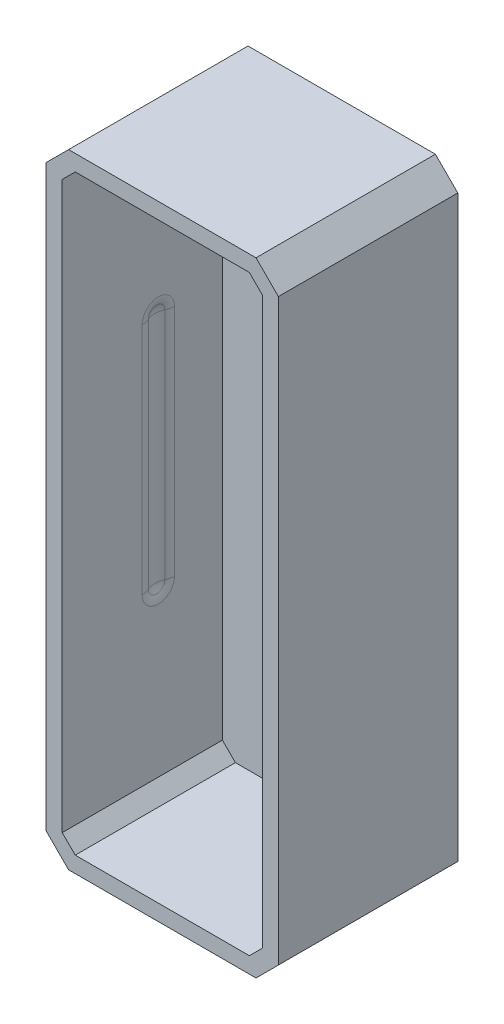
ISO-10303-21;
HEADER;
FILE_DESCRIPTION(('STEP AP214'),'2;1');
FILE_NAME('part.step','',(''),(''),'','','');
FILE_SCHEMA(('AUTOMOTIVE_DESIGN { 1 0 10303 214 1 1 1 1 }'));
ENDSEC;
DATA;
#1=APPLICATION_CONTEXT('core data for automotive mechanical design processes');
#2=APPLICATION_PROTOCOL_DEFINITION('international standard','automotive_design',2000,#1);
#3=PRODUCT_CONTEXT('',#1,'mechanical');
#4=PRODUCT('Part','Part','',(#3));
#5=PRODUCT_RELATED_PRODUCT_CATEGORY('part','',(#4));
#6=PRODUCT_DEFINITION_FORMATION('','',#4);
#7=PRODUCT_DEFINITION_CONTEXT('part definition',#1,'design');
#8=PRODUCT_DEFINITION('design','',#6,#7);
#9=PRODUCT_DEFINITION_SHAPE('','',#8);
#10=(LENGTH_UNIT() NAMED_UNIT(*) SI_UNIT(.MILLI.,.METRE.));
#11=(NAMED_UNIT(*) PLANE_ANGLE_UNIT() SI_UNIT($,.RADIAN.));
#12=(NAMED_UNIT(*) SI_UNIT($,.STERADIAN.) SOLID_ANGLE_UNIT());
#13=UNCERTAINTY_MEASURE_WITH_UNIT(LENGTH_MEASURE(1.E-05),#10,'distance_accuracy_value','');
#14=(GEOMETRIC_REPRESENTATION_CONTEXT(3) GLOBAL_UNCERTAINTY_ASSIGNED_CONTEXT((#13)) GLOBAL_UNIT_ASSIGNED_CONTEXT((#10,
#11,#12)) REPRESENTATION_CONTEXT('',''));
#15=CARTESIAN_POINT('',(0.,0.,0.));
#16=DIRECTION('',(0.,0.,1.));
#17=DIRECTION('',(1.,0.,0.));
#18=AXIS2_PLACEMENT_3D('',#15,#16,#17);
#19=CARTESIAN_POINT('',(15.6182481042385,-44.1430822833915,25.));
#20=DIRECTION('',(-1.,0.,0.));
#21=DIRECTION('',(0.,0.,1.));
#22=AXIS2_PLACEMENT_3D('',#19,#20,#21);
#23=PLANE('',#22);
#24=CARTESIAN_POINT('',(15.6182481042385,-18.2371897436196,9.99999999999999));
#25=DIRECTION('',(-1.,0.,0.));
#26=DIRECTION('',(0.,0.,1.));
#27=AXIS2_PLACEMENT_3D('',#24,#25,#26);
#28=CIRCLE('',#27,2.53130401176941);
#29=CARTESIAN_POINT('',(15.6182481042385,-18.2371897436196,12.5313040117694));
#30=VERTEX_POINT('',#29);
#31=CARTESIAN_POINT('',(15.6182481042385,-18.2371897436196,7.46869598823058));
#32=VERTEX_POINT('',#31);
#33=EDGE_CURVE('E376',#30,#32,#28,.F.);
#34=ORIENTED_EDGE('',*,*,#33,.T.);
#35=DIRECTION('',(0.,1.,0.));
#36=VECTOR('',#35,1.);
#37=CARTESIAN_POINT('',(15.6182481042385,-44.1430822833915,7.46869598823058));
#38=LINE('',#37,#36);
#39=CARTESIAN_POINT('',(15.6182481042385,18.2371897436196,7.46869598823058));
#40=VERTEX_POINT('',#39);
#41=EDGE_CURVE('E381',#32,#40,#38,.T.);
#42=ORIENTED_EDGE('',*,*,#41,.T.);
#43=CARTESIAN_POINT('',(15.6182481042385,18.2371897436196,9.99999999999999));
#44=DIRECTION('',(-1.,0.,0.));
#45=DIRECTION('',(0.,0.,1.));
#46=AXIS2_PLACEMENT_3D('',#43,#44,#45);
#47=CIRCLE('',#46,2.53130401176941);
#48=CARTESIAN_POINT('',(15.6182481042385,18.2371897436196,12.5313040117694));
#49=VERTEX_POINT('',#48);
#50=EDGE_CURVE('E378',#40,#49,#47,.F.);
#51=ORIENTED_EDGE('',*,*,#50,.T.);
#52=DIRECTION('',(0.,1.,0.));
#53=VECTOR('',#52,1.);
#54=CARTESIAN_POINT('',(15.6182481042385,-44.1430822833915,12.5313040117694));
#55=LINE('',#54,#53);
#56=EDGE_CURVE('E374',#49,#30,#55,.F.);
#57=ORIENTED_EDGE('',*,*,#56,.T.);
#58=EDGE_LOOP('',(#34,#42,#51,#57));
#59=FACE_BOUND('',#58,.T.);
#60=DIRECTION('',(0.,1.,0.));
#61=VECTOR('',#60,1.);
#62=CARTESIAN_POINT('',(15.6182481042385,-44.1430822833915,0.));
#63=LINE('',#62,#61);
#64=CARTESIAN_POINT('',(15.6182481042385,-44.1430822833915,0.));
#65=VERTEX_POINT('',#64);
#66=CARTESIAN_POINT('',(15.6182481042385,44.1430822833914,0.));
#67=VERTEX_POINT('',#66);
#68=EDGE_CURVE('E213',#65,#67,#63,.T.);
#69=ORIENTED_EDGE('',*,*,#68,.F.);
#70=DIRECTION('',(0.,0.,-1.));
#71=VECTOR('',#70,1.);
#72=CARTESIAN_POINT('',(15.6182481042385,-44.1430822833915,25.));
#73=LINE('',#72,#71);
#74=CARTESIAN_POINT('',(15.6182481042385,-44.1430822833915,25.));
#75=VERTEX_POINT('',#74);
#76=EDGE_CURVE('E258',#75,#65,#73,.T.);
#77=ORIENTED_EDGE('',*,*,#76,.F.);
#78=DIRECTION('',(0.,1.,0.));
#79=VECTOR('',#78,1.);
#80=CARTESIAN_POINT('',(15.6182481042385,-44.1430822833915,25.));
#81=LINE('',#80,#79);
#82=CARTESIAN_POINT('',(15.6182481042385,44.1430822833914,25.));
#83=VERTEX_POINT('',#82);
#84=EDGE_CURVE('E240',#75,#83,#81,.T.);
#85=ORIENTED_EDGE('',*,*,#84,.T.);
#86=DIRECTION('',(0.,0.,-1.));
#87=VECTOR('',#86,1.);
#88=CARTESIAN_POINT('',(15.6182481042385,44.1430822833914,25.));
#89=LINE('',#88,#87);
#90=EDGE_CURVE('E208',#83,#67,#89,.T.);
#91=ORIENTED_EDGE('',*,*,#90,.T.);
#92=EDGE_LOOP('',(#69,#77,#85,#91));
#93=FACE_BOUND('',#92,.T.);
#94=ADVANCED_FACE('F39',(#59,#93),#23,.T.);
#95=CARTESIAN_POINT('',(-15.6182481042385,44.1430822833914,25.));
#96=DIRECTION('',(1.,0.,0.));
#97=DIRECTION('',(0.,0.,-1.));
#98=AXIS2_PLACEMENT_3D('',#95,#96,#97);
#99=PLANE('',#98);
#100=CARTESIAN_POINT('',(-15.6182481042385,-18.2371897436196,9.99999999999999));
#101=DIRECTION('',(1.,0.,0.));
#102=DIRECTION('',(0.,0.,-1.));
#103=AXIS2_PLACEMENT_3D('',#100,#101,#102);
#104=CIRCLE('',#103,2.53130401176944);
#105=CARTESIAN_POINT('',(-15.6182481042385,-18.2371897436196,7.46869598823055));
#106=VERTEX_POINT('',#105);
#107=CARTESIAN_POINT('',(-15.6182481042385,-18.2371897436196,12.5313040117694));
#108=VERTEX_POINT('',#107);
#109=EDGE_CURVE('E347',#106,#108,#104,.F.);
#110=ORIENTED_EDGE('',*,*,#109,.T.);
#111=DIRECTION('',(0.,-1.,0.));
#112=VECTOR('',#111,1.);
#113=CARTESIAN_POINT('',(-15.6182481042385,18.2371897436196,12.5313040117694));
#114=LINE('',#113,#112);
#115=CARTESIAN_POINT('',(-15.6182481042385,18.2371897436196,12.5313040117694));
#116=VERTEX_POINT('',#115);
#117=EDGE_CURVE('E350',#108,#116,#114,.F.);
#118=ORIENTED_EDGE('',*,*,#117,.T.);
#119=CARTESIAN_POINT('',(-15.6182481042385,18.2371897436196,9.99999999999999));
#120=DIRECTION('',(1.,0.,0.));
#121=DIRECTION('',(0.,0.,-1.));
#122=AXIS2_PLACEMENT_3D('',#119,#120,#121);
#123=CIRCLE('',#122,2.53130401176944);
#124=CARTESIAN_POINT('',(-15.6182481042385,18.2371897436196,7.46869598823055));
#125=VERTEX_POINT('',#124);
#126=EDGE_CURVE('E345',#116,#125,#123,.F.);
#127=ORIENTED_EDGE('',*,*,#126,.T.);
#128=DIRECTION('',(0.,-1.,0.));
#129=VECTOR('',#128,1.);
#130=CARTESIAN_POINT('',(-15.6182481042385,-18.2371897436196,7.46869598823055));
#131=LINE('',#130,#129);
#132=EDGE_CURVE('E343',#125,#106,#131,.T.);
#133=ORIENTED_EDGE('',*,*,#132,.T.);
#134=EDGE_LOOP('',(#110,#118,#127,#133));
#135=FACE_BOUND('',#134,.T.);
#136=DIRECTION('',(0.,-1.,0.));
#137=VECTOR('',#136,1.);
#138=CARTESIAN_POINT('',(-15.6182481042385,44.1430822833914,0.));
#139=LINE('',#138,#137);
#140=CARTESIAN_POINT('',(-15.6182481042385,44.1430822833914,0.));
#141=VERTEX_POINT('',#140);
#142=CARTESIAN_POINT('',(-15.6182481042385,-44.1430822833914,0.));
#143=VERTEX_POINT('',#142);
#144=EDGE_CURVE('E248',#141,#143,#139,.T.);
#145=ORIENTED_EDGE('',*,*,#144,.F.);
#146=DIRECTION('',(0.,0.,-1.));
#147=VECTOR('',#146,1.);
#148=CARTESIAN_POINT('',(-15.6182481042385,44.1430822833914,25.));
#149=LINE('',#148,#147);
#150=CARTESIAN_POINT('',(-15.6182481042385,44.1430822833914,25.));
#151=VERTEX_POINT('',#150);
#152=EDGE_CURVE('E270',#151,#141,#149,.T.);
#153=ORIENTED_EDGE('',*,*,#152,.F.);
#154=DIRECTION('',(0.,-1.,0.));
#155=VECTOR('',#154,1.);
#156=CARTESIAN_POINT('',(-15.6182481042385,44.1430822833914,25.));
#157=LINE('',#156,#155);
#158=CARTESIAN_POINT('',(-15.6182481042385,-44.1430822833914,25.));
#159=VERTEX_POINT('',#158);
#160=EDGE_CURVE('E229',#151,#159,#157,.T.);
#161=ORIENTED_EDGE('',*,*,#160,.T.);
#162=DIRECTION('',(0.,0.,-1.));
#163=VECTOR('',#162,1.);
#164=CARTESIAN_POINT('',(-15.6182481042385,-44.1430822833914,25.));
#165=LINE('',#164,#163);
#166=EDGE_CURVE('E267',#159,#143,#165,.T.);
#167=ORIENTED_EDGE('',*,*,#166,.T.);
#168=EDGE_LOOP('',(#145,#153,#161,#167));
#169=FACE_BOUND('',#168,.T.);
#170=ADVANCED_FACE('F418',(#135,#169),#99,.T.);
#171=CARTESIAN_POINT('',(18.1182481042385,45.1786161893242,-3.));
#172=DIRECTION('',(0.707106781186545,0.70710678118655,0.));
#173=DIRECTION('',(-0.70710678118655,0.707106781186545,0.));
#174=AXIS2_PLACEMENT_3D('',#171,#172,#173);
#175=PLANE('',#174);
#176=DIRECTION('',(0.,0.,1.));
#177=VECTOR('',#176,1.);
#178=CARTESIAN_POINT('',(14.6244926882899,48.6723716052728,-3.));
#179=LINE('',#178,#177);
#180=CARTESIAN_POINT('',(14.6244926882899,48.6723716052728,-3.));
#181=VERTEX_POINT('',#180);
#182=CARTESIAN_POINT('',(14.6244926882899,48.6723716052728,25.));
#183=VERTEX_POINT('',#182);
#184=EDGE_CURVE('E321',#181,#183,#179,.T.);
#185=ORIENTED_EDGE('',*,*,#184,.T.);
#186=DIRECTION('',(-0.70710678118655,0.707106781186545,0.));
#187=VECTOR('',#186,1.);
#188=CARTESIAN_POINT('',(18.1182481042385,45.1786161893242,25.));
#189=LINE('',#188,#187);
#190=CARTESIAN_POINT('',(18.1182481042385,45.1786161893242,25.));
#191=VERTEX_POINT('',#190);
#192=EDGE_CURVE('E288',#191,#183,#189,.T.);
#193=ORIENTED_EDGE('',*,*,#192,.F.);
#194=DIRECTION('',(0.,0.,1.));
#195=VECTOR('',#194,1.);
#196=CARTESIAN_POINT('',(18.1182481042385,45.1786161893242,-3.));
#197=LINE('',#196,#195);
#198=CARTESIAN_POINT('',(18.1182481042385,45.1786161893242,-3.));
#199=VERTEX_POINT('',#198);
#200=EDGE_CURVE('E322',#199,#191,#197,.T.);
#201=ORIENTED_EDGE('',*,*,#200,.F.);
#202=DIRECTION('',(-0.70710678118655,0.707106781186545,0.));
#203=VECTOR('',#202,1.);
#204=CARTESIAN_POINT('',(18.1182481042385,45.1786161893242,-3.));
#205=LINE('',#204,#203);
#206=EDGE_CURVE('E297',#199,#181,#205,.T.);
#207=ORIENTED_EDGE('',*,*,#206,.T.);
#208=EDGE_LOOP('',(#185,#193,#201,#207));
#209=FACE_BOUND('',#208,.T.);
#210=ADVANCED_FACE('F471',(#209),#175,.T.);
#211=CARTESIAN_POINT('',(18.1182481042385,-45.1786161893242,-3.));
#212=DIRECTION('',(1.,0.,0.));
#213=DIRECTION('',(0.,0.,-1.));
#214=AXIS2_PLACEMENT_3D('',#211,#212,#213);
#215=PLANE('',#214);
#216=ORIENTED_EDGE('',*,*,#200,.T.);
#217=DIRECTION('',(0.,1.,0.));
#218=VECTOR('',#217,1.);
#219=CARTESIAN_POINT('',(18.1182481042385,-45.1786161893242,25.));
#220=LINE('',#219,#218);
#221=CARTESIAN_POINT('',(18.1182481042385,-45.1786161893242,25.));
#222=VERTEX_POINT('',#221);
#223=EDGE_CURVE('E285',#222,#191,#220,.T.);
#224=ORIENTED_EDGE('',*,*,#223,.F.);
#225=DIRECTION('',(0.,0.,1.));
#226=VECTOR('',#225,1.);
#227=CARTESIAN_POINT('',(18.1182481042385,-45.1786161893242,-3.));
#228=LINE('',#227,#226);
#229=CARTESIAN_POINT('',(18.1182481042385,-45.1786161893242,-3.));
#230=VERTEX_POINT('',#229);
#231=EDGE_CURVE('E325',#230,#222,#228,.T.);
#232=ORIENTED_EDGE('',*,*,#231,.F.);
#233=DIRECTION('',(0.,1.,0.));
#234=VECTOR('',#233,1.);
#235=CARTESIAN_POINT('',(18.1182481042385,-45.1786161893242,-3.));
#236=LINE('',#235,#234);
#237=EDGE_CURVE('E318',#230,#199,#236,.T.);
#238=ORIENTED_EDGE('',*,*,#237,.T.);
#239=EDGE_LOOP('',(#216,#224,#232,#238));
#240=FACE_BOUND('',#239,.T.);
#241=ADVANCED_FACE('F467',(#240),#215,.T.);
#242=CARTESIAN_POINT('',(14.62449268829,-48.6723716052728,-3.));
#243=DIRECTION('',(0.707106781186549,-0.707106781186546,0.));
#244=DIRECTION('',(0.707106781186546,0.707106781186549,0.));
#245=AXIS2_PLACEMENT_3D('',#242,#243,#244);
#246=PLANE('',#245);
#247=ORIENTED_EDGE('',*,*,#231,.T.);
#248=DIRECTION('',(0.707106781186546,0.707106781186549,0.));
#249=VECTOR('',#248,1.);
#250=CARTESIAN_POINT('',(14.62449268829,-48.6723716052728,25.));
#251=LINE('',#250,#249);
#252=CARTESIAN_POINT('',(14.62449268829,-48.6723716052728,25.));
#253=VERTEX_POINT('',#252);
#254=EDGE_CURVE('E282',#253,#222,#251,.T.);
#255=ORIENTED_EDGE('',*,*,#254,.F.);
#256=DIRECTION('',(0.,0.,1.));
#257=VECTOR('',#256,1.);
#258=CARTESIAN_POINT('',(14.62449268829,-48.6723716052728,-3.));
#259=LINE('',#258,#257);
#260=CARTESIAN_POINT('',(14.62449268829,-48.6723716052728,-3.));
#261=VERTEX_POINT('',#260);
#262=EDGE_CURVE('E327',#261,#253,#259,.T.);
#263=ORIENTED_EDGE('',*,*,#262,.F.);
#264=DIRECTION('',(0.707106781186546,0.707106781186549,0.));
#265=VECTOR('',#264,1.);
#266=CARTESIAN_POINT('',(14.62449268829,-48.6723716052728,-3.));
#267=LINE('',#266,#265);
#268=EDGE_CURVE('E315',#261,#230,#267,.T.);
#269=ORIENTED_EDGE('',*,*,#268,.T.);
#270=EDGE_LOOP('',(#247,#255,#263,#269));
#271=FACE_BOUND('',#270,.T.);
#272=ADVANCED_FACE('F470',(#271),#246,.T.);
#273=CARTESIAN_POINT('',(-14.6244926882899,-48.6723716052728,-3.));
#274=DIRECTION('',(0.,-1.,0.));
#275=DIRECTION('',(0.,0.,-1.));
#276=AXIS2_PLACEMENT_3D('',#273,#274,#275);
#277=PLANE('',#276);
#278=ORIENTED_EDGE('',*,*,#262,.T.);
#279=DIRECTION('',(1.,0.,0.));
#280=VECTOR('',#279,1.);
#281=CARTESIAN_POINT('',(-14.6244926882899,-48.6723716052728,25.));
#282=LINE('',#281,#280);
#283=CARTESIAN_POINT('',(-14.6244926882899,-48.6723716052728,25.));
#284=VERTEX_POINT('',#283);
#285=EDGE_CURVE('E279',#284,#253,#282,.T.);
#286=ORIENTED_EDGE('',*,*,#285,.F.);
#287=DIRECTION('',(0.,0.,1.));
#288=VECTOR('',#287,1.);
#289=CARTESIAN_POINT('',(-14.6244926882899,-48.6723716052728,-3.));
#290=LINE('',#289,#288);
#291=CARTESIAN_POINT('',(-14.6244926882899,-48.6723716052728,-3.));
#292=VERTEX_POINT('',#291);
#293=EDGE_CURVE('E329',#292,#284,#290,.T.);
#294=ORIENTED_EDGE('',*,*,#293,.F.);
#295=DIRECTION('',(1.,0.,0.));
#296=VECTOR('',#295,1.);
#297=CARTESIAN_POINT('',(-14.6244926882899,-48.6723716052728,-3.));
#298=LINE('',#297,#296);
#299=EDGE_CURVE('E312',#292,#261,#298,.T.);
#300=ORIENTED_EDGE('',*,*,#299,.T.);
#301=EDGE_LOOP('',(#278,#286,#294,#300));
#302=FACE_BOUND('',#301,.T.);
#303=ADVANCED_FACE('F475',(#302),#277,.T.);
#304=CARTESIAN_POINT('',(-18.1182481042385,-45.1786161893242,-3.));
#305=DIRECTION('',(-0.707106781186545,-0.70710678118655,0.));
#306=DIRECTION('',(0.70710678118655,-0.707106781186545,0.));
#307=AXIS2_PLACEMENT_3D('',#304,#305,#306);
#308=PLANE('',#307);
#309=ORIENTED_EDGE('',*,*,#293,.T.);
#310=DIRECTION('',(0.70710678118655,-0.707106781186545,0.));
#311=VECTOR('',#310,1.);
#312=CARTESIAN_POINT('',(-18.1182481042385,-45.1786161893242,25.));
#313=LINE('',#312,#311);
#314=CARTESIAN_POINT('',(-18.1182481042385,-45.1786161893242,25.));
#315=VERTEX_POINT('',#314);
#316=EDGE_CURVE('E276',#315,#284,#313,.T.);
#317=ORIENTED_EDGE('',*,*,#316,.F.);
#318=DIRECTION('',(0.,0.,1.));
#319=VECTOR('',#318,1.);
#320=CARTESIAN_POINT('',(-18.1182481042385,-45.1786161893242,-3.));
#321=LINE('',#320,#319);
#322=CARTESIAN_POINT('',(-18.1182481042385,-45.1786161893242,-3.));
#323=VERTEX_POINT('',#322);
#324=EDGE_CURVE('E331',#323,#315,#321,.T.);
#325=ORIENTED_EDGE('',*,*,#324,.F.);
#326=DIRECTION('',(0.70710678118655,-0.707106781186545,0.));
#327=VECTOR('',#326,1.);
#328=CARTESIAN_POINT('',(-18.1182481042385,-45.1786161893242,-3.));
#329=LINE('',#328,#327);
#330=EDGE_CURVE('E309',#323,#292,#329,.T.);
#331=ORIENTED_EDGE('',*,*,#330,.T.);
#332=EDGE_LOOP('',(#309,#317,#325,#331));
#333=FACE_BOUND('',#332,.T.);
#334=ADVANCED_FACE('F479',(#333),#308,.T.);
#335=CARTESIAN_POINT('',(-18.1182481042385,45.1786161893242,-3.));
#336=DIRECTION('',(-1.,0.,0.));
#337=DIRECTION('',(0.,0.,1.));
#338=AXIS2_PLACEMENT_3D('',#335,#336,#337);
#339=PLANE('',#338);
#340=ORIENTED_EDGE('',*,*,#324,.T.);
#341=DIRECTION('',(0.,-1.,0.));
#342=VECTOR('',#341,1.);
#343=CARTESIAN_POINT('',(-18.1182481042385,45.1786161893242,25.));
#344=LINE('',#343,#342);
#345=CARTESIAN_POINT('',(-18.1182481042385,45.1786161893242,25.));
#346=VERTEX_POINT('',#345);
#347=EDGE_CURVE('E221',#346,#315,#344,.T.);
#348=ORIENTED_EDGE('',*,*,#347,.F.);
#349=DIRECTION('',(0.,0.,1.));
#350=VECTOR('',#349,1.);
#351=CARTESIAN_POINT('',(-18.1182481042385,45.1786161893242,-3.));
#352=LINE('',#351,#350);
#353=CARTESIAN_POINT('',(-18.1182481042385,45.1786161893242,-3.));
#354=VERTEX_POINT('',#353);
#355=EDGE_CURVE('E333',#354,#346,#352,.T.);
#356=ORIENTED_EDGE('',*,*,#355,.F.);
#357=DIRECTION('',(0.,-1.,0.));
#358=VECTOR('',#357,1.);
#359=CARTESIAN_POINT('',(-18.1182481042385,45.1786161893242,-3.));
#360=LINE('',#359,#358);
#361=EDGE_CURVE('E306',#354,#323,#360,.T.);
#362=ORIENTED_EDGE('',*,*,#361,.T.);
#363=EDGE_LOOP('',(#340,#348,#356,#362));
#364=FACE_BOUND('',#363,.T.);
#365=ADVANCED_FACE('F483',(#364),#339,.T.);
#366=CARTESIAN_POINT('',(-14.62449268829,48.6723716052728,-3.));
#367=DIRECTION('',(-0.707106781186551,0.707106781186544,0.));
#368=DIRECTION('',(-0.707106781186544,-0.707106781186551,0.));
#369=AXIS2_PLACEMENT_3D('',#366,#367,#368);
#370=PLANE('',#369);
#371=ORIENTED_EDGE('',*,*,#355,.T.);
#372=DIRECTION('',(-0.707106781186544,-0.707106781186551,0.));
#373=VECTOR('',#372,1.);
#374=CARTESIAN_POINT('',(-14.62449268829,48.6723716052728,25.));
#375=LINE('',#374,#373);
#376=CARTESIAN_POINT('',(-14.62449268829,48.6723716052728,25.));
#377=VERTEX_POINT('',#376);
#378=EDGE_CURVE('E294',#377,#346,#375,.T.);
#379=ORIENTED_EDGE('',*,*,#378,.F.);
#380=DIRECTION('',(0.,0.,1.));
#381=VECTOR('',#380,1.);
#382=CARTESIAN_POINT('',(-14.62449268829,48.6723716052728,-3.));
#383=LINE('',#382,#381);
#384=CARTESIAN_POINT('',(-14.62449268829,48.6723716052728,-3.));
#385=VERTEX_POINT('',#384);
#386=EDGE_CURVE('E335',#385,#377,#383,.T.);
#387=ORIENTED_EDGE('',*,*,#386,.F.);
#388=DIRECTION('',(-0.707106781186544,-0.707106781186551,0.));
#389=VECTOR('',#388,1.);
#390=CARTESIAN_POINT('',(-14.62449268829,48.6723716052728,-3.));
#391=LINE('',#390,#389);
#392=EDGE_CURVE('E303',#385,#354,#391,.T.);
#393=ORIENTED_EDGE('',*,*,#392,.T.);
#394=EDGE_LOOP('',(#371,#379,#387,#393));
#395=FACE_BOUND('',#394,.T.);
#396=ADVANCED_FACE('F487',(#395),#370,.T.);
#397=CARTESIAN_POINT('',(14.6244926882899,48.6723716052728,-3.));
#398=DIRECTION('',(0.,1.,0.));
#399=DIRECTION('',(0.,0.,1.));
#400=AXIS2_PLACEMENT_3D('',#397,#398,#399);
#401=PLANE('',#400);
#402=ORIENTED_EDGE('',*,*,#386,.T.);
#403=DIRECTION('',(-1.,0.,0.));
#404=VECTOR('',#403,1.);
#405=CARTESIAN_POINT('',(14.6244926882899,48.6723716052728,25.));
#406=LINE('',#405,#404);
#407=EDGE_CURVE('E291',#183,#377,#406,.T.);
#408=ORIENTED_EDGE('',*,*,#407,.F.);
#409=ORIENTED_EDGE('',*,*,#184,.F.);
#410=DIRECTION('',(-1.,0.,0.));
#411=VECTOR('',#410,1.);
#412=CARTESIAN_POINT('',(14.6244926882899,48.6723716052728,-3.));
#413=LINE('',#412,#411);
#414=EDGE_CURVE('E300',#181,#385,#413,.T.);
#415=ORIENTED_EDGE('',*,*,#414,.T.);
#416=EDGE_LOOP('',(#402,#408,#409,#415));
#417=FACE_BOUND('',#416,.T.);
#418=ADVANCED_FACE('F462',(#417),#401,.T.);
#419=CARTESIAN_POINT('',(0.,0.,-3.));
#420=DIRECTION('',(0.,0.,1.));
#421=DIRECTION('',(1.,0.,0.));
#422=AXIS2_PLACEMENT_3D('',#419,#420,#421);
#423=PLANE('',#422);
#424=ORIENTED_EDGE('',*,*,#206,.F.);
#425=ORIENTED_EDGE('',*,*,#237,.F.);
#426=ORIENTED_EDGE('',*,*,#268,.F.);
#427=ORIENTED_EDGE('',*,*,#299,.F.);
#428=ORIENTED_EDGE('',*,*,#330,.F.);
#429=ORIENTED_EDGE('',*,*,#361,.F.);
#430=ORIENTED_EDGE('',*,*,#392,.F.);
#431=ORIENTED_EDGE('',*,*,#414,.F.);
#432=EDGE_LOOP('',(#424,#425,#426,#427,#428,#429,#430,#431));
#433=FACE_BOUND('',#432,.T.);
#434=ADVANCED_FACE('F458',(#433),#423,.F.);
#435=CARTESIAN_POINT('',(0.,0.,25.));
#436=DIRECTION('',(0.,0.,1.));
#437=DIRECTION('',(1.,0.,0.));
#438=AXIS2_PLACEMENT_3D('',#435,#436,#437);
#439=PLANE('',#438);
#440=ORIENTED_EDGE('',*,*,#347,.T.);
#441=ORIENTED_EDGE('',*,*,#316,.T.);
#442=ORIENTED_EDGE('',*,*,#285,.T.);
#443=ORIENTED_EDGE('',*,*,#254,.T.);
#444=ORIENTED_EDGE('',*,*,#223,.T.);
#445=ORIENTED_EDGE('',*,*,#192,.T.);
#446=ORIENTED_EDGE('',*,*,#407,.T.);
#447=ORIENTED_EDGE('',*,*,#378,.T.);
#448=EDGE_LOOP('',(#440,#441,#442,#443,#444,#445,#446,#447));
#449=FACE_BOUND('',#448,.T.);
#450=DIRECTION('',(-1.,0.,0.));
#451=VECTOR('',#450,1.);
#452=CARTESIAN_POINT('',(13.5889587823572,46.1723716052728,25.));
#453=LINE('',#452,#451);
#454=CARTESIAN_POINT('',(13.5889587823572,46.1723716052728,25.));
#455=VERTEX_POINT('',#454);
#456=CARTESIAN_POINT('',(-13.5889587823572,46.1723716052728,25.));
#457=VERTEX_POINT('',#456);
#458=EDGE_CURVE('E212',#455,#457,#453,.T.);
#459=ORIENTED_EDGE('',*,*,#458,.F.);
#460=DIRECTION('',(-0.70710678118655,0.707106781186545,0.));
#461=VECTOR('',#460,1.);
#462=CARTESIAN_POINT('',(15.6182481042385,44.1430822833914,25.));
#463=LINE('',#462,#461);
#464=EDGE_CURVE('E202',#83,#455,#463,.T.);
#465=ORIENTED_EDGE('',*,*,#464,.F.);
#466=ORIENTED_EDGE('',*,*,#84,.F.);
#467=DIRECTION('',(0.707106781186548,0.707106781186547,0.));
#468=VECTOR('',#467,1.);
#469=CARTESIAN_POINT('',(13.5889587823572,-46.1723716052728,25.));
#470=LINE('',#469,#468);
#471=CARTESIAN_POINT('',(13.5889587823572,-46.1723716052728,25.));
#472=VERTEX_POINT('',#471);
#473=EDGE_CURVE('E237',#472,#75,#470,.T.);
#474=ORIENTED_EDGE('',*,*,#473,.F.);
#475=DIRECTION('',(1.,0.,0.));
#476=VECTOR('',#475,1.);
#477=CARTESIAN_POINT('',(-13.5889587823572,-46.1723716052728,25.));
#478=LINE('',#477,#476);
#479=CARTESIAN_POINT('',(-13.5889587823572,-46.1723716052728,25.));
#480=VERTEX_POINT('',#479);
#481=EDGE_CURVE('E235',#480,#472,#478,.T.);
#482=ORIENTED_EDGE('',*,*,#481,.F.);
#483=DIRECTION('',(0.70710678118655,-0.707106781186545,0.));
#484=VECTOR('',#483,1.);
#485=CARTESIAN_POINT('',(-15.6182481042385,-44.1430822833914,25.));
#486=LINE('',#485,#484);
#487=EDGE_CURVE('E233',#159,#480,#486,.T.);
#488=ORIENTED_EDGE('',*,*,#487,.F.);
#489=ORIENTED_EDGE('',*,*,#160,.F.);
#490=DIRECTION('',(-0.707106781186544,-0.707106781186551,0.));
#491=VECTOR('',#490,1.);
#492=CARTESIAN_POINT('',(-13.5889587823572,46.1723716052728,25.));
#493=LINE('',#492,#491);
#494=EDGE_CURVE('E227',#457,#151,#493,.T.);
#495=ORIENTED_EDGE('',*,*,#494,.F.);
#496=EDGE_LOOP('',(#459,#465,#466,#474,#482,#488,#489,#495));
#497=FACE_BOUND('',#496,.T.);
#498=ADVANCED_FACE('F225',(#449,#497),#439,.T.);
#499=CARTESIAN_POINT('',(15.6182481042385,44.1430822833914,25.));
#500=DIRECTION('',(-0.707106781186545,-0.70710678118655,0.));
#501=DIRECTION('',(0.70710678118655,-0.707106781186545,0.));
#502=AXIS2_PLACEMENT_3D('',#499,#500,#501);
#503=PLANE('',#502);
#504=DIRECTION('',(-0.70710678118655,0.707106781186545,0.));
#505=VECTOR('',#504,1.);
#506=CARTESIAN_POINT('',(15.6182481042385,44.1430822833914,0.));
#507=LINE('',#506,#505);
#508=CARTESIAN_POINT('',(13.5889587823572,46.1723716052728,0.));
#509=VERTEX_POINT('',#508);
#510=EDGE_CURVE('E242',#67,#509,#507,.T.);
#511=ORIENTED_EDGE('',*,*,#510,.F.);
#512=ORIENTED_EDGE('',*,*,#90,.F.);
#513=ORIENTED_EDGE('',*,*,#464,.T.);
#514=DIRECTION('',(0.,0.,-1.));
#515=VECTOR('',#514,1.);
#516=CARTESIAN_POINT('',(13.5889587823572,46.1723716052728,25.));
#517=LINE('',#516,#515);
#518=EDGE_CURVE('E206',#455,#509,#517,.T.);
#519=ORIENTED_EDGE('',*,*,#518,.T.);
#520=EDGE_LOOP('',(#511,#512,#513,#519));
#521=FACE_BOUND('',#520,.T.);
#522=ADVANCED_FACE('F205',(#521),#503,.T.);
#523=CARTESIAN_POINT('',(13.5889587823572,46.1723716052728,25.));
#524=DIRECTION('',(0.,-1.,0.));
#525=DIRECTION('',(0.,0.,-1.));
#526=AXIS2_PLACEMENT_3D('',#523,#524,#525);
#527=PLANE('',#526);
#528=DIRECTION('',(-1.,0.,0.));
#529=VECTOR('',#528,1.);
#530=CARTESIAN_POINT('',(13.5889587823572,46.1723716052728,0.));
#531=LINE('',#530,#529);
#532=CARTESIAN_POINT('',(-13.5889587823572,46.1723716052728,0.));
#533=VERTEX_POINT('',#532);
#534=EDGE_CURVE('E220',#509,#533,#531,.T.);
#535=ORIENTED_EDGE('',*,*,#534,.F.);
#536=ORIENTED_EDGE('',*,*,#518,.F.);
#537=ORIENTED_EDGE('',*,*,#458,.T.);
#538=DIRECTION('',(0.,0.,-1.));
#539=VECTOR('',#538,1.);
#540=CARTESIAN_POINT('',(-13.5889587823572,46.1723716052728,25.));
#541=LINE('',#540,#539);
#542=EDGE_CURVE('E222',#457,#533,#541,.T.);
#543=ORIENTED_EDGE('',*,*,#542,.T.);
#544=EDGE_LOOP('',(#535,#536,#537,#543));
#545=FACE_BOUND('',#544,.T.);
#546=ADVANCED_FACE('F217',(#545),#527,.T.);
#547=CARTESIAN_POINT('',(-13.5889587823572,46.1723716052728,25.));
#548=DIRECTION('',(0.707106781186551,-0.707106781186544,0.));
#549=DIRECTION('',(0.707106781186544,0.707106781186551,0.));
#550=AXIS2_PLACEMENT_3D('',#547,#548,#549);
#551=PLANE('',#550);
#552=DIRECTION('',(-0.707106781186544,-0.707106781186551,0.));
#553=VECTOR('',#552,1.);
#554=CARTESIAN_POINT('',(-13.5889587823572,46.1723716052728,0.));
#555=LINE('',#554,#553);
#556=EDGE_CURVE('E246',#533,#141,#555,.T.);
#557=ORIENTED_EDGE('',*,*,#556,.F.);
#558=ORIENTED_EDGE('',*,*,#542,.F.);
#559=ORIENTED_EDGE('',*,*,#494,.T.);
#560=ORIENTED_EDGE('',*,*,#152,.T.);
#561=EDGE_LOOP('',(#557,#558,#559,#560));
#562=FACE_BOUND('',#561,.T.);
#563=ADVANCED_FACE('F443',(#562),#551,.T.);
#564=CARTESIAN_POINT('',(-15.6182481042385,-44.1430822833914,25.));
#565=DIRECTION('',(0.707106781186545,0.70710678118655,0.));
#566=DIRECTION('',(-0.70710678118655,0.707106781186545,0.));
#567=AXIS2_PLACEMENT_3D('',#564,#565,#566);
#568=PLANE('',#567);
#569=DIRECTION('',(0.70710678118655,-0.707106781186545,0.));
#570=VECTOR('',#569,1.);
#571=CARTESIAN_POINT('',(-15.6182481042385,-44.1430822833914,0.));
#572=LINE('',#571,#570);
#573=CARTESIAN_POINT('',(-13.5889587823572,-46.1723716052728,0.));
#574=VERTEX_POINT('',#573);
#575=EDGE_CURVE('E250',#143,#574,#572,.T.);
#576=ORIENTED_EDGE('',*,*,#575,.F.);
#577=ORIENTED_EDGE('',*,*,#166,.F.);
#578=ORIENTED_EDGE('',*,*,#487,.T.);
#579=DIRECTION('',(0.,0.,-1.));
#580=VECTOR('',#579,1.);
#581=CARTESIAN_POINT('',(-13.5889587823572,-46.1723716052728,25.));
#582=LINE('',#581,#580);
#583=EDGE_CURVE('E264',#480,#574,#582,.T.);
#584=ORIENTED_EDGE('',*,*,#583,.T.);
#585=EDGE_LOOP('',(#576,#577,#578,#584));
#586=FACE_BOUND('',#585,.T.);
#587=ADVANCED_FACE('F436',(#586),#568,.T.);
#588=CARTESIAN_POINT('',(-13.5889587823572,-46.1723716052728,25.));
#589=DIRECTION('',(0.,1.,0.));
#590=DIRECTION('',(0.,0.,1.));
#591=AXIS2_PLACEMENT_3D('',#588,#589,#590);
#592=PLANE('',#591);
#593=DIRECTION('',(1.,0.,0.));
#594=VECTOR('',#593,1.);
#595=CARTESIAN_POINT('',(-13.5889587823572,-46.1723716052728,0.));
#596=LINE('',#595,#594);
#597=CARTESIAN_POINT('',(13.5889587823572,-46.1723716052728,0.));
#598=VERTEX_POINT('',#597);
#599=EDGE_CURVE('E252',#574,#598,#596,.T.);
#600=ORIENTED_EDGE('',*,*,#599,.F.);
#601=ORIENTED_EDGE('',*,*,#583,.F.);
#602=ORIENTED_EDGE('',*,*,#481,.T.);
#603=DIRECTION('',(0.,0.,-1.));
#604=VECTOR('',#603,1.);
#605=CARTESIAN_POINT('',(13.5889587823572,-46.1723716052728,25.));
#606=LINE('',#605,#604);
#607=EDGE_CURVE('E261',#472,#598,#606,.T.);
#608=ORIENTED_EDGE('',*,*,#607,.T.);
#609=EDGE_LOOP('',(#600,#601,#602,#608));
#610=FACE_BOUND('',#609,.T.);
#611=ADVANCED_FACE('F433',(#610),#592,.T.);
#612=CARTESIAN_POINT('',(13.5889587823572,-46.1723716052728,25.));
#613=DIRECTION('',(-0.707106781186547,0.707106781186548,0.));
#614=DIRECTION('',(-0.707106781186548,-0.707106781186547,0.));
#615=AXIS2_PLACEMENT_3D('',#612,#613,#614);
#616=PLANE('',#615);
#617=DIRECTION('',(0.707106781186548,0.707106781186547,0.));
#618=VECTOR('',#617,1.);
#619=CARTESIAN_POINT('',(13.5889587823572,-46.1723716052728,0.));
#620=LINE('',#619,#618);
#621=EDGE_CURVE('E254',#598,#65,#620,.T.);
#622=ORIENTED_EDGE('',*,*,#621,.F.);
#623=ORIENTED_EDGE('',*,*,#607,.F.);
#624=ORIENTED_EDGE('',*,*,#473,.T.);
#625=ORIENTED_EDGE('',*,*,#76,.T.);
#626=EDGE_LOOP('',(#622,#623,#624,#625));
#627=FACE_BOUND('',#626,.T.);
#628=ADVANCED_FACE('F427',(#627),#616,.T.);
#629=CARTESIAN_POINT('',(0.,0.,0.));
#630=DIRECTION('',(0.,0.,1.));
#631=DIRECTION('',(1.,0.,0.));
#632=AXIS2_PLACEMENT_3D('',#629,#630,#631);
#633=PLANE('',#632);
#634=ORIENTED_EDGE('',*,*,#510,.T.);
#635=ORIENTED_EDGE('',*,*,#534,.T.);
#636=ORIENTED_EDGE('',*,*,#556,.T.);
#637=ORIENTED_EDGE('',*,*,#144,.T.);
#638=ORIENTED_EDGE('',*,*,#575,.T.);
#639=ORIENTED_EDGE('',*,*,#599,.T.);
#640=ORIENTED_EDGE('',*,*,#621,.T.);
#641=ORIENTED_EDGE('',*,*,#68,.T.);
#642=EDGE_LOOP('',(#634,#635,#636,#637,#638,#639,#640,#641));
#643=FACE_BOUND('',#642,.T.);
#644=ADVANCED_FACE('F422',(#643),#633,.T.);
#645=CARTESIAN_POINT('',(-13.0682481042385,-20.,9.99999999999999));
#646=DIRECTION('',(0.,1.,0.));
#647=DIRECTION('',(0.,0.,1.));
#648=AXIS2_PLACEMENT_3D('',#645,#646,#647);
#649=CYLINDRICAL_SURFACE('',#648,3.1);
#650=CARTESIAN_POINT('',(-13.0682481042385,18.2371897436196,9.99999999999999));
#651=DIRECTION('',(0.,1.,0.));
#652=DIRECTION('',(0.,0.,1.));
#653=AXIS2_PLACEMENT_3D('',#650,#651,#652);
#654=CIRCLE('',#653,3.1);
#655=CARTESIAN_POINT('',(-15.8887399075172,18.2371897436196,8.71359960057618));
#656=VERTEX_POINT('',#655);
#657=CARTESIAN_POINT('',(-15.8887399075172,18.2371897436196,11.2864003994238));
#658=VERTEX_POINT('',#657);
#659=EDGE_CURVE('E340',#656,#658,#654,.T.);
#660=ORIENTED_EDGE('',*,*,#659,.T.);
#661=DIRECTION('',(0.,1.,0.));
#662=VECTOR('',#661,1.);
#663=CARTESIAN_POINT('',(-15.8887399075172,-20.,11.2864003994238));
#664=LINE('',#663,#662);
#665=CARTESIAN_POINT('',(-15.8887399075172,-18.2371897436196,11.2864003994238));
#666=VERTEX_POINT('',#665);
#667=EDGE_CURVE('E359',#658,#666,#664,.F.);
#668=ORIENTED_EDGE('',*,*,#667,.T.);
#669=CARTESIAN_POINT('',(-13.0682481042385,-18.2371897436196,9.99999999999999));
#670=DIRECTION('',(0.,1.,0.));
#671=DIRECTION('',(0.,0.,1.));
#672=AXIS2_PLACEMENT_3D('',#669,#670,#671);
#673=CIRCLE('',#672,3.1);
#674=CARTESIAN_POINT('',(-15.8887399075172,-18.2371897436196,8.71359960057618));
#675=VERTEX_POINT('',#674);
#676=EDGE_CURVE('E324',#666,#675,#673,.F.);
#677=ORIENTED_EDGE('',*,*,#676,.T.);
#678=DIRECTION('',(0.,1.,0.));
#679=VECTOR('',#678,1.);
#680=CARTESIAN_POINT('',(-15.8887399075172,-20.,8.71359960057618));
#681=LINE('',#680,#679);
#682=EDGE_CURVE('E357',#675,#656,#681,.T.);
#683=ORIENTED_EDGE('',*,*,#682,.T.);
#684=EDGE_LOOP('',(#660,#668,#677,#683));
#685=FACE_BOUND('',#684,.T.);
#686=ADVANCED_FACE('F466',(#685),#649,.F.);
#687=CARTESIAN_POINT('',(-13.0682481042385,18.2371897436196,9.99999999999999));
#688=DIRECTION('',(0.822580645161288,-0.568648469800139,0.));
#689=DIRECTION('',(0.568648469800139,0.822580645161288,0.));
#690=AXIS2_PLACEMENT_3D('',#687,#688,#689);
#691=SPHERICAL_SURFACE('',#690,3.1);
#692=ORIENTED_EDGE('',*,*,#659,.F.);
#693=CARTESIAN_POINT('',(-15.8887399075172,18.2371897436196,9.99999999999999));
#694=DIRECTION('',(1.,0.,0.));
#695=DIRECTION('',(0.,0.,-1.));
#696=AXIS2_PLACEMENT_3D('',#693,#694,#695);
#697=CIRCLE('',#696,1.28640039942382);
#698=EDGE_CURVE('E355',#656,#658,#697,.T.);
#699=ORIENTED_EDGE('',*,*,#698,.T.);
#700=EDGE_LOOP('',(#692,#699));
#701=FACE_BOUND('',#700,.T.);
#702=ADVANCED_FACE('F498',(#701),#691,.F.);
#703=CARTESIAN_POINT('',(-13.0682481042385,-18.2371897436196,9.99999999999999));
#704=DIRECTION('',(0.822580645161288,0.568648469800139,0.));
#705=DIRECTION('',(-0.568648469800139,0.822580645161288,0.));
#706=AXIS2_PLACEMENT_3D('',#703,#704,#705);
#707=SPHERICAL_SURFACE('',#706,3.1);
#708=ORIENTED_EDGE('',*,*,#676,.F.);
#709=CARTESIAN_POINT('',(-15.8887399075172,-18.2371897436196,9.99999999999999));
#710=DIRECTION('',(1.,0.,0.));
#711=DIRECTION('',(0.,0.,-1.));
#712=AXIS2_PLACEMENT_3D('',#709,#710,#711);
#713=CIRCLE('',#712,1.28640039942382);
#714=EDGE_CURVE('E352',#666,#675,#713,.T.);
#715=ORIENTED_EDGE('',*,*,#714,.T.);
#716=EDGE_LOOP('',(#708,#715));
#717=FACE_BOUND('',#716,.T.);
#718=ADVANCED_FACE('F501',(#717),#707,.F.);
#719=CARTESIAN_POINT('',(-18.6182481042385,18.2371897436196,9.99999999999999));
#720=DIRECTION('',(1.,0.,0.));
#721=DIRECTION('',(0.,0.,-1.));
#722=AXIS2_PLACEMENT_3D('',#719,#720,#721);
#723=DEGENERATE_TOROIDAL_SURFACE('',#722,2.53130401176944,3.,.T.);
#724=CARTESIAN_POINT('',(-18.6182481042385,18.2371897436196,12.5313040117694));
#725=DIRECTION('',(0.,-1.,0.));
#726=DIRECTION('',(0.,0.,-1.));
#727=AXIS2_PLACEMENT_3D('',#724,#725,#726);
#728=CIRCLE('',#727,3.);
#729=EDGE_CURVE('E366',#658,#116,#728,.T.);
#730=ORIENTED_EDGE('',*,*,#729,.F.);
#731=ORIENTED_EDGE('',*,*,#698,.F.);
#732=CARTESIAN_POINT('',(-18.6182481042385,18.2371897436196,7.46869598823055));
#733=DIRECTION('',(0.,-1.,0.));
#734=DIRECTION('',(0.,0.,-1.));
#735=AXIS2_PLACEMENT_3D('',#732,#733,#734);
#736=CIRCLE('',#735,3.);
#737=EDGE_CURVE('E244',#125,#656,#736,.T.);
#738=ORIENTED_EDGE('',*,*,#737,.F.);
#739=ORIENTED_EDGE('',*,*,#126,.F.);
#740=EDGE_LOOP('',(#730,#731,#738,#739));
#741=FACE_BOUND('',#740,.T.);
#742=ADVANCED_FACE('F505',(#741),#723,.T.);
#743=CARTESIAN_POINT('',(-18.6182481042385,-20.,7.46869598823055));
#744=DIRECTION('',(0.,1.,0.));
#745=DIRECTION('',(0.,0.,1.));
#746=AXIS2_PLACEMENT_3D('',#743,#744,#745);
#747=CYLINDRICAL_SURFACE('',#746,3.);
#748=ORIENTED_EDGE('',*,*,#737,.T.);
#749=ORIENTED_EDGE('',*,*,#682,.F.);
#750=CARTESIAN_POINT('',(-18.6182481042385,-18.2371897436196,7.46869598823055));
#751=DIRECTION('',(0.,-1.,0.));
#752=DIRECTION('',(0.,0.,-1.));
#753=AXIS2_PLACEMENT_3D('',#750,#751,#752);
#754=CIRCLE('',#753,3.);
#755=EDGE_CURVE('E364',#106,#675,#754,.T.);
#756=ORIENTED_EDGE('',*,*,#755,.F.);
#757=ORIENTED_EDGE('',*,*,#132,.F.);
#758=EDGE_LOOP('',(#748,#749,#756,#757));
#759=FACE_BOUND('',#758,.T.);
#760=ADVANCED_FACE('F514',(#759),#747,.T.);
#761=CARTESIAN_POINT('',(-18.6182481042385,-20.,12.5313040117694));
#762=DIRECTION('',(0.,1.,0.));
#763=DIRECTION('',(0.,0.,1.));
#764=AXIS2_PLACEMENT_3D('',#761,#762,#763);
#765=CYLINDRICAL_SURFACE('',#764,3.);
#766=ORIENTED_EDGE('',*,*,#729,.T.);
#767=ORIENTED_EDGE('',*,*,#117,.F.);
#768=CARTESIAN_POINT('',(-18.6182481042385,-18.2371897436196,12.5313040117694));
#769=DIRECTION('',(0.,-1.,0.));
#770=DIRECTION('',(0.,0.,-1.));
#771=AXIS2_PLACEMENT_3D('',#768,#769,#770);
#772=CIRCLE('',#771,3.);
#773=EDGE_CURVE('E362',#666,#108,#772,.T.);
#774=ORIENTED_EDGE('',*,*,#773,.F.);
#775=ORIENTED_EDGE('',*,*,#667,.F.);
#776=EDGE_LOOP('',(#766,#767,#774,#775));
#777=FACE_BOUND('',#776,.T.);
#778=ADVANCED_FACE('F510',(#777),#765,.T.);
#779=CARTESIAN_POINT('',(-18.6182481042385,-18.2371897436196,9.99999999999999));
#780=DIRECTION('',(1.,0.,0.));
#781=DIRECTION('',(0.,0.,-1.));
#782=AXIS2_PLACEMENT_3D('',#779,#780,#781);
#783=DEGENERATE_TOROIDAL_SURFACE('',#782,2.53130401176944,3.,.T.);
#784=ORIENTED_EDGE('',*,*,#755,.T.);
#785=ORIENTED_EDGE('',*,*,#714,.F.);
#786=ORIENTED_EDGE('',*,*,#773,.T.);
#787=ORIENTED_EDGE('',*,*,#109,.F.);
#788=EDGE_LOOP('',(#784,#785,#786,#787));
#789=FACE_BOUND('',#788,.T.);
#790=ADVANCED_FACE('F507',(#789),#783,.T.);
#791=CARTESIAN_POINT('',(13.0682481042385,-20.,9.99999999999999));
#792=DIRECTION('',(0.,1.,0.));
#793=DIRECTION('',(0.,0.,1.));
#794=AXIS2_PLACEMENT_3D('',#791,#792,#793);
#795=CYLINDRICAL_SURFACE('',#794,3.1);
#796=CARTESIAN_POINT('',(13.0682481042385,18.2371897436196,9.99999999999999));
#797=DIRECTION('',(0.,1.,0.));
#798=DIRECTION('',(0.,0.,1.));
#799=AXIS2_PLACEMENT_3D('',#796,#797,#798);
#800=CIRCLE('',#799,3.1);
#801=CARTESIAN_POINT('',(15.8887399075172,18.2371897436196,11.2864003994238));
#802=VERTEX_POINT('',#801);
#803=CARTESIAN_POINT('',(15.8887399075172,18.2371897436196,8.71359960057619));
#804=VERTEX_POINT('',#803);
#805=EDGE_CURVE('E372',#802,#804,#800,.T.);
#806=ORIENTED_EDGE('',*,*,#805,.T.);
#807=DIRECTION('',(0.,1.,0.));
#808=VECTOR('',#807,1.);
#809=CARTESIAN_POINT('',(15.8887399075172,-20.,8.71359960057619));
#810=LINE('',#809,#808);
#811=CARTESIAN_POINT('',(15.8887399075172,-18.2371897436196,8.71359960057619));
#812=VERTEX_POINT('',#811);
#813=EDGE_CURVE('E11',#804,#812,#810,.F.);
#814=ORIENTED_EDGE('',*,*,#813,.T.);
#815=CARTESIAN_POINT('',(13.0682481042385,-18.2371897436196,9.99999999999999));
#816=DIRECTION('',(0.,1.,0.));
#817=DIRECTION('',(0.,0.,1.));
#818=AXIS2_PLACEMENT_3D('',#815,#816,#817);
#819=CIRCLE('',#818,3.1);
#820=CARTESIAN_POINT('',(15.8887399075172,-18.2371897436196,11.2864003994238));
#821=VERTEX_POINT('',#820);
#822=EDGE_CURVE('E361',#812,#821,#819,.F.);
#823=ORIENTED_EDGE('',*,*,#822,.T.);
#824=DIRECTION('',(0.,1.,0.));
#825=VECTOR('',#824,1.);
#826=CARTESIAN_POINT('',(15.8887399075172,-20.,11.2864003994238));
#827=LINE('',#826,#825);
#828=EDGE_CURVE('E48',#821,#802,#827,.T.);
#829=ORIENTED_EDGE('',*,*,#828,.T.);
#830=EDGE_LOOP('',(#806,#814,#823,#829));
#831=FACE_BOUND('',#830,.T.);
#832=ADVANCED_FACE('F408',(#831),#795,.F.);
#833=CARTESIAN_POINT('',(13.0682481042385,18.2371897436196,9.99999999999999));
#834=DIRECTION('',(-0.822580645161292,-0.568648469800132,0.));
#835=DIRECTION('',(0.568648469800133,-0.822580645161292,0.));
#836=AXIS2_PLACEMENT_3D('',#833,#834,#835);
#837=SPHERICAL_SURFACE('',#836,3.1);
#838=ORIENTED_EDGE('',*,*,#805,.F.);
#839=CARTESIAN_POINT('',(15.8887399075172,18.2371897436196,9.99999999999999));
#840=DIRECTION('',(-1.,0.,0.));
#841=DIRECTION('',(0.,0.,1.));
#842=AXIS2_PLACEMENT_3D('',#839,#840,#841);
#843=CIRCLE('',#842,1.2864003994238);
#844=EDGE_CURVE('E383',#802,#804,#843,.T.);
#845=ORIENTED_EDGE('',*,*,#844,.T.);
#846=EDGE_LOOP('',(#838,#845));
#847=FACE_BOUND('',#846,.T.);
#848=ADVANCED_FACE('F411',(#847),#837,.F.);
#849=CARTESIAN_POINT('',(13.0682481042385,-18.2371897436196,9.99999999999999));
#850=DIRECTION('',(-0.822580645161292,0.568648469800132,0.));
#851=DIRECTION('',(-0.568648469800133,-0.822580645161292,0.));
#852=AXIS2_PLACEMENT_3D('',#849,#850,#851);
#853=SPHERICAL_SURFACE('',#852,3.1);
#854=ORIENTED_EDGE('',*,*,#822,.F.);
#855=CARTESIAN_POINT('',(15.8887399075172,-18.2371897436196,9.99999999999999));
#856=DIRECTION('',(-1.,0.,0.));
#857=DIRECTION('',(0.,0.,1.));
#858=AXIS2_PLACEMENT_3D('',#855,#856,#857);
#859=CIRCLE('',#858,1.2864003994238);
#860=EDGE_CURVE('E55',#812,#821,#859,.T.);
#861=ORIENTED_EDGE('',*,*,#860,.T.);
#862=EDGE_LOOP('',(#854,#861));
#863=FACE_BOUND('',#862,.T.);
#864=ADVANCED_FACE('F524',(#863),#853,.F.);
#865=CARTESIAN_POINT('',(18.6182481042385,-18.2371897436196,9.99999999999999));
#866=DIRECTION('',(-1.,0.,0.));
#867=DIRECTION('',(0.,0.,1.));
#868=AXIS2_PLACEMENT_3D('',#865,#866,#867);
#869=DEGENERATE_TOROIDAL_SURFACE('',#868,2.53130401176941,3.,.T.);
#870=CARTESIAN_POINT('',(18.6182481042385,-18.2371897436196,12.5313040117694));
#871=DIRECTION('',(0.,1.,0.));
#872=DIRECTION('',(0.,0.,1.));
#873=AXIS2_PLACEMENT_3D('',#870,#871,#872);
#874=CIRCLE('',#873,3.);
#875=EDGE_CURVE('E391',#821,#30,#874,.T.);
#876=ORIENTED_EDGE('',*,*,#875,.F.);
#877=ORIENTED_EDGE('',*,*,#860,.F.);
#878=CARTESIAN_POINT('',(18.6182481042385,-18.2371897436196,7.46869598823058));
#879=DIRECTION('',(0.,1.,0.));
#880=DIRECTION('',(0.,0.,1.));
#881=AXIS2_PLACEMENT_3D('',#878,#879,#880);
#882=CIRCLE('',#881,3.);
#883=EDGE_CURVE('E43',#32,#812,#882,.T.);
#884=ORIENTED_EDGE('',*,*,#883,.F.);
#885=ORIENTED_EDGE('',*,*,#33,.F.);
#886=EDGE_LOOP('',(#876,#877,#884,#885));
#887=FACE_BOUND('',#886,.T.);
#888=ADVANCED_FACE('F41',(#887),#869,.T.);
#889=CARTESIAN_POINT('',(18.6182481042385,-20.,7.46869598823058));
#890=DIRECTION('',(0.,1.,0.));
#891=DIRECTION('',(0.,0.,1.));
#892=AXIS2_PLACEMENT_3D('',#889,#890,#891);
#893=CYLINDRICAL_SURFACE('',#892,3.);
#894=ORIENTED_EDGE('',*,*,#883,.T.);
#895=ORIENTED_EDGE('',*,*,#813,.F.);
#896=CARTESIAN_POINT('',(18.6182481042385,18.2371897436196,7.46869598823058));
#897=DIRECTION('',(0.,1.,0.));
#898=DIRECTION('',(0.,0.,1.));
#899=AXIS2_PLACEMENT_3D('',#896,#897,#898);
#900=CIRCLE('',#899,3.);
#901=EDGE_CURVE('E390',#40,#804,#900,.T.);
#902=ORIENTED_EDGE('',*,*,#901,.F.);
#903=ORIENTED_EDGE('',*,*,#41,.F.);
#904=EDGE_LOOP('',(#894,#895,#902,#903));
#905=FACE_BOUND('',#904,.T.);
#906=ADVANCED_FACE('F401',(#905),#893,.T.);
#907=CARTESIAN_POINT('',(18.6182481042385,-20.,12.5313040117694));
#908=DIRECTION('',(0.,1.,0.));
#909=DIRECTION('',(0.,0.,1.));
#910=AXIS2_PLACEMENT_3D('',#907,#908,#909);
#911=CYLINDRICAL_SURFACE('',#910,3.);
#912=ORIENTED_EDGE('',*,*,#875,.T.);
#913=ORIENTED_EDGE('',*,*,#56,.F.);
#914=CARTESIAN_POINT('',(18.6182481042385,18.2371897436196,12.5313040117694));
#915=DIRECTION('',(0.,1.,0.));
#916=DIRECTION('',(0.,0.,1.));
#917=AXIS2_PLACEMENT_3D('',#914,#915,#916);
#918=CIRCLE('',#917,3.);
#919=EDGE_CURVE('E388',#802,#49,#918,.T.);
#920=ORIENTED_EDGE('',*,*,#919,.F.);
#921=ORIENTED_EDGE('',*,*,#828,.F.);
#922=EDGE_LOOP('',(#912,#913,#920,#921));
#923=FACE_BOUND('',#922,.T.);
#924=ADVANCED_FACE('F406',(#923),#911,.T.);
#925=CARTESIAN_POINT('',(18.6182481042385,18.2371897436196,9.99999999999999));
#926=DIRECTION('',(-1.,0.,0.));
#927=DIRECTION('',(0.,0.,1.));
#928=AXIS2_PLACEMENT_3D('',#925,#926,#927);
#929=DEGENERATE_TOROIDAL_SURFACE('',#928,2.53130401176941,3.,.T.);
#930=ORIENTED_EDGE('',*,*,#901,.T.);
#931=ORIENTED_EDGE('',*,*,#844,.F.);
#932=ORIENTED_EDGE('',*,*,#919,.T.);
#933=ORIENTED_EDGE('',*,*,#50,.F.);
#934=EDGE_LOOP('',(#930,#931,#932,#933));
#935=FACE_BOUND('',#934,.T.);
#936=ADVANCED_FACE('F413',(#935),#929,.T.);
#937=CLOSED_SHELL('',(#94,#170,#210,#241,#272,#303,#334,#365,#396,#418,#434,#498,#522,#546,#563,
#587,#611,#628,#644,#686,#702,#718,#742,#760,#778,#790,#832,#848,#864,#888,#906,#924,#936));
#938=MANIFOLD_SOLID_BREP('B2',#937);
#939=ADVANCED_BREP_SHAPE_REPRESENTATION('',(#18,#938),#14);
#940=SHAPE_DEFINITION_REPRESENTATION(#9,#939);
ENDSEC;
END-ISO-10303-21;
